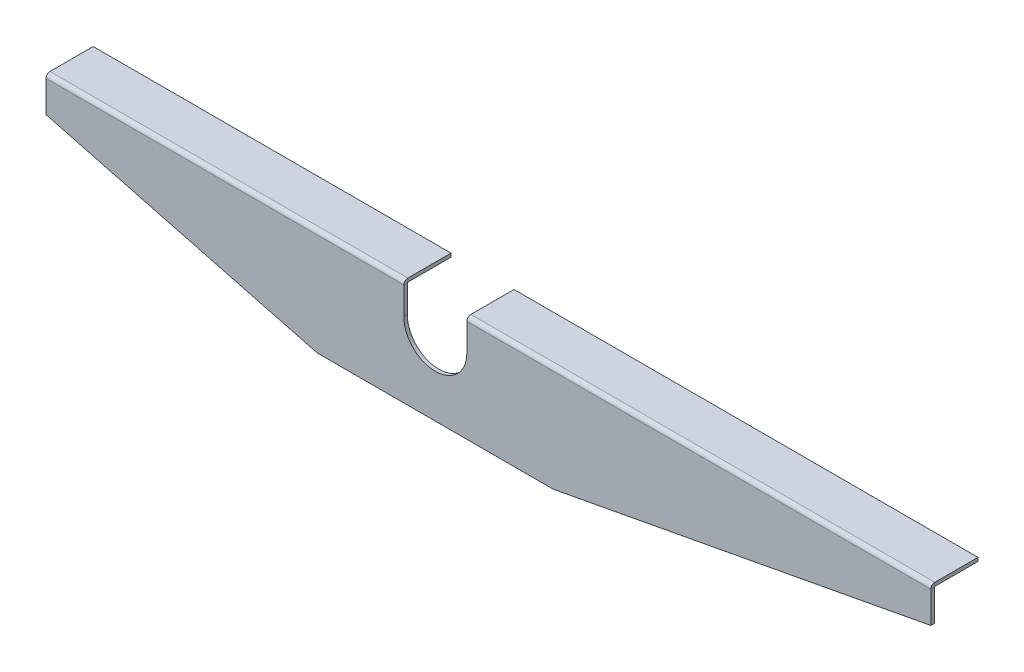
ISO-10303-21;
HEADER;
FILE_DESCRIPTION(('STEP AP214'),'2;1');
FILE_NAME('part.step','',(''),(''),'','','');
FILE_SCHEMA(('AUTOMOTIVE_DESIGN { 1 0 10303 214 1 1 1 1 }'));
ENDSEC;
DATA;
#1=APPLICATION_CONTEXT('core data for automotive mechanical design processes');
#2=APPLICATION_PROTOCOL_DEFINITION('international standard','automotive_design',2000,#1);
#3=PRODUCT_CONTEXT('',#1,'mechanical');
#4=PRODUCT('Part','Part','',(#3));
#5=PRODUCT_RELATED_PRODUCT_CATEGORY('part','',(#4));
#6=PRODUCT_DEFINITION_FORMATION('','',#4);
#7=PRODUCT_DEFINITION_CONTEXT('part definition',#1,'design');
#8=PRODUCT_DEFINITION('design','',#6,#7);
#9=PRODUCT_DEFINITION_SHAPE('','',#8);
#10=(LENGTH_UNIT() NAMED_UNIT(*) SI_UNIT(.MILLI.,.METRE.));
#11=(NAMED_UNIT(*) PLANE_ANGLE_UNIT() SI_UNIT($,.RADIAN.));
#12=(NAMED_UNIT(*) SI_UNIT($,.STERADIAN.) SOLID_ANGLE_UNIT());
#13=UNCERTAINTY_MEASURE_WITH_UNIT(LENGTH_MEASURE(1.E-05),#10,'distance_accuracy_value','');
#14=(GEOMETRIC_REPRESENTATION_CONTEXT(3) GLOBAL_UNCERTAINTY_ASSIGNED_CONTEXT((#13)) GLOBAL_UNIT_ASSIGNED_CONTEXT((#10,
#11,#12)) REPRESENTATION_CONTEXT('',''));
#15=CARTESIAN_POINT('',(0.,0.,0.));
#16=DIRECTION('',(0.,0.,1.));
#17=DIRECTION('',(1.,0.,0.));
#18=AXIS2_PLACEMENT_3D('',#15,#16,#17);
#19=CARTESIAN_POINT('',(0.,0.,-1.50000000000006));
#20=DIRECTION('',(0.,0.,1.));
#21=DIRECTION('',(1.,0.,0.));
#22=AXIS2_PLACEMENT_3D('',#19,#20,#21);
#23=PLANE('',#22);
#24=DIRECTION('',(1.,0.,0.));
#25=VECTOR('',#24,1.);
#26=CARTESIAN_POINT('',(210.,11.65,-1.50000000000006));
#27=LINE('',#26,#25);
#28=CARTESIAN_POINT('',(210.,11.65,-1.50000000000006));
#29=VERTEX_POINT('',#28);
#30=CARTESIAN_POINT('',(13.35,11.65,-1.50000000000006));
#31=VERTEX_POINT('',#30);
#32=EDGE_CURVE('E686',#29,#31,#27,.F.);
#33=ORIENTED_EDGE('',*,*,#32,.F.);
#34=DIRECTION('',(0.,1.,0.));
#35=VECTOR('',#34,1.);
#36=CARTESIAN_POINT('',(210.,13.35,-1.50000000000006));
#37=LINE('',#36,#35);
#38=CARTESIAN_POINT('',(210.,-1.64999999999998,-1.50000000000006));
#39=VERTEX_POINT('',#38);
#40=EDGE_CURVE('E179',#39,#29,#37,.T.);
#41=ORIENTED_EDGE('',*,*,#40,.F.);
#42=DIRECTION('',(0.982872186934322,0.184288535050185,0.));
#43=VECTOR('',#42,1.);
#44=CARTESIAN_POINT('',(210.,-1.64999999999998,-1.50000000000006));
#45=LINE('',#44,#43);
#46=CARTESIAN_POINT('',(50.,-31.65,-1.50000000000006));
#47=VERTEX_POINT('',#46);
#48=EDGE_CURVE('E161',#47,#39,#45,.T.);
#49=ORIENTED_EDGE('',*,*,#48,.F.);
#50=DIRECTION('',(1.,0.,0.));
#51=VECTOR('',#50,1.);
#52=CARTESIAN_POINT('',(50.,-31.65,-1.50000000000006));
#53=LINE('',#52,#51);
#54=CARTESIAN_POINT('',(-50.,-31.65,-1.50000000000006));
#55=VERTEX_POINT('',#54);
#56=EDGE_CURVE('E176',#55,#47,#53,.T.);
#57=ORIENTED_EDGE('',*,*,#56,.F.);
#58=DIRECTION('',(0.967617272396844,-0.252421897147003,0.));
#59=VECTOR('',#58,1.);
#60=CARTESIAN_POINT('',(-50.,-31.65,-1.50000000000006));
#61=LINE('',#60,#59);
#62=CARTESIAN_POINT('',(-165.,-1.64999999999998,-1.50000000000006));
#63=VERTEX_POINT('',#62);
#64=EDGE_CURVE('E184',#63,#55,#61,.T.);
#65=ORIENTED_EDGE('',*,*,#64,.F.);
#66=DIRECTION('',(0.,-1.,0.));
#67=VECTOR('',#66,1.);
#68=CARTESIAN_POINT('',(-165.,-1.64999999999998,-1.50000000000006));
#69=LINE('',#68,#67);
#70=CARTESIAN_POINT('',(-165.,11.65,-1.50000000000006));
#71=VERTEX_POINT('',#70);
#72=EDGE_CURVE('E188',#71,#63,#69,.T.);
#73=ORIENTED_EDGE('',*,*,#72,.F.);
#74=DIRECTION('',(1.,0.,0.));
#75=VECTOR('',#74,1.);
#76=CARTESIAN_POINT('',(-13.35,11.65,-1.50000000000006));
#77=LINE('',#76,#75);
#78=CARTESIAN_POINT('',(-13.35,11.65,-1.50000000000006));
#79=VERTEX_POINT('',#78);
#80=EDGE_CURVE('E763',#79,#71,#77,.F.);
#81=ORIENTED_EDGE('',*,*,#80,.F.);
#82=DIRECTION('',(0.,1.,0.));
#83=VECTOR('',#82,1.);
#84=CARTESIAN_POINT('',(-13.35,13.35,-1.50000000000006));
#85=LINE('',#84,#83);
#86=CARTESIAN_POINT('',(-13.35,0.,-1.50000000000006));
#87=VERTEX_POINT('',#86);
#88=EDGE_CURVE('E776',#87,#79,#85,.T.);
#89=ORIENTED_EDGE('',*,*,#88,.F.);
#90=CARTESIAN_POINT('',(0.,0.,-1.50000000000006));
#91=DIRECTION('',(0.,0.,-1.));
#92=DIRECTION('',(1.,0.,0.));
#93=AXIS2_PLACEMENT_3D('',#90,#91,#92);
#94=CIRCLE('',#93,13.35);
#95=CARTESIAN_POINT('',(13.35,0.,-1.50000000000006));
#96=VERTEX_POINT('',#95);
#97=EDGE_CURVE('E221',#96,#87,#94,.T.);
#98=ORIENTED_EDGE('',*,*,#97,.F.);
#99=DIRECTION('',(0.,-1.,0.));
#100=VECTOR('',#99,1.);
#101=CARTESIAN_POINT('',(13.35,0.,-1.50000000000006));
#102=LINE('',#101,#100);
#103=EDGE_CURVE('E110',#31,#96,#102,.T.);
#104=ORIENTED_EDGE('',*,*,#103,.F.);
#105=EDGE_LOOP('',(#33,#41,#49,#57,#65,#73,#81,#89,#98,#104));
#106=FACE_BOUND('',#105,.T.);
#107=ADVANCED_FACE('F84',(#106),#23,.F.);
#108=CARTESIAN_POINT('',(0.,0.,0.));
#109=DIRECTION('',(0.,0.,1.));
#110=DIRECTION('',(1.,0.,0.));
#111=AXIS2_PLACEMENT_3D('',#108,#109,#110);
#112=PLANE('',#111);
#113=DIRECTION('',(0.,1.,0.));
#114=VECTOR('',#113,1.);
#115=CARTESIAN_POINT('',(210.,13.35,0.));
#116=LINE('',#115,#114);
#117=CARTESIAN_POINT('',(210.,-1.64999999999998,0.));
#118=VERTEX_POINT('',#117);
#119=CARTESIAN_POINT('',(210.,11.65,0.));
#120=VERTEX_POINT('',#119);
#121=EDGE_CURVE('E216',#118,#120,#116,.T.);
#122=ORIENTED_EDGE('',*,*,#121,.T.);
#123=DIRECTION('',(1.,0.,0.));
#124=VECTOR('',#123,1.);
#125=CARTESIAN_POINT('',(210.,11.65,0.));
#126=LINE('',#125,#124);
#127=CARTESIAN_POINT('',(13.35,11.65,0.));
#128=VERTEX_POINT('',#127);
#129=EDGE_CURVE('E670',#120,#128,#126,.F.);
#130=ORIENTED_EDGE('',*,*,#129,.T.);
#131=DIRECTION('',(0.,-1.,0.));
#132=VECTOR('',#131,1.);
#133=CARTESIAN_POINT('',(13.35,0.,0.));
#134=LINE('',#133,#132);
#135=CARTESIAN_POINT('',(13.35,0.,0.));
#136=VERTEX_POINT('',#135);
#137=EDGE_CURVE('E139',#128,#136,#134,.T.);
#138=ORIENTED_EDGE('',*,*,#137,.T.);
#139=CARTESIAN_POINT('',(0.,0.,0.));
#140=DIRECTION('',(0.,0.,-1.));
#141=DIRECTION('',(1.,0.,0.));
#142=AXIS2_PLACEMENT_3D('',#139,#140,#141);
#143=CIRCLE('',#142,13.35);
#144=CARTESIAN_POINT('',(-13.35,0.,0.));
#145=VERTEX_POINT('',#144);
#146=EDGE_CURVE('E196',#136,#145,#143,.T.);
#147=ORIENTED_EDGE('',*,*,#146,.T.);
#148=DIRECTION('',(0.,1.,0.));
#149=VECTOR('',#148,1.);
#150=CARTESIAN_POINT('',(-13.35,13.35,0.));
#151=LINE('',#150,#149);
#152=CARTESIAN_POINT('',(-13.35,11.65,0.));
#153=VERTEX_POINT('',#152);
#154=EDGE_CURVE('E199',#145,#153,#151,.T.);
#155=ORIENTED_EDGE('',*,*,#154,.T.);
#156=DIRECTION('',(1.,0.,0.));
#157=VECTOR('',#156,1.);
#158=CARTESIAN_POINT('',(-13.35,11.65,0.));
#159=LINE('',#158,#157);
#160=CARTESIAN_POINT('',(-165.,11.65,0.));
#161=VERTEX_POINT('',#160);
#162=EDGE_CURVE('E750',#153,#161,#159,.F.);
#163=ORIENTED_EDGE('',*,*,#162,.T.);
#164=DIRECTION('',(0.,-1.,0.));
#165=VECTOR('',#164,1.);
#166=CARTESIAN_POINT('',(-165.,-1.64999999999998,0.));
#167=LINE('',#166,#165);
#168=CARTESIAN_POINT('',(-165.,-1.64999999999998,0.));
#169=VERTEX_POINT('',#168);
#170=EDGE_CURVE('E204',#161,#169,#167,.T.);
#171=ORIENTED_EDGE('',*,*,#170,.T.);
#172=DIRECTION('',(0.967617272396844,-0.252421897147003,0.));
#173=VECTOR('',#172,1.);
#174=CARTESIAN_POINT('',(-50.,-31.65,0.));
#175=LINE('',#174,#173);
#176=CARTESIAN_POINT('',(-50.,-31.65,0.));
#177=VERTEX_POINT('',#176);
#178=EDGE_CURVE('E207',#169,#177,#175,.T.);
#179=ORIENTED_EDGE('',*,*,#178,.T.);
#180=DIRECTION('',(1.,0.,0.));
#181=VECTOR('',#180,1.);
#182=CARTESIAN_POINT('',(50.,-31.65,0.));
#183=LINE('',#182,#181);
#184=CARTESIAN_POINT('',(50.,-31.65,0.));
#185=VERTEX_POINT('',#184);
#186=EDGE_CURVE('E211',#177,#185,#183,.T.);
#187=ORIENTED_EDGE('',*,*,#186,.T.);
#188=DIRECTION('',(0.982872186934322,0.184288535050185,0.));
#189=VECTOR('',#188,1.);
#190=CARTESIAN_POINT('',(210.,-1.64999999999998,0.));
#191=LINE('',#190,#189);
#192=EDGE_CURVE('E163',#185,#118,#191,.T.);
#193=ORIENTED_EDGE('',*,*,#192,.T.);
#194=EDGE_LOOP('',(#122,#130,#138,#147,#155,#163,#171,#179,#187,#193));
#195=FACE_BOUND('',#194,.T.);
#196=ADVANCED_FACE('F246',(#195),#112,.T.);
#197=CARTESIAN_POINT('',(210.,13.35,-1.50000000000006));
#198=DIRECTION('',(1.,0.,0.));
#199=DIRECTION('',(0.,0.,-1.));
#200=AXIS2_PLACEMENT_3D('',#197,#198,#199);
#201=PLANE('',#200);
#202=ORIENTED_EDGE('',*,*,#40,.T.);
#203=DIRECTION('',(0.,0.,1.));
#204=VECTOR('',#203,1.);
#205=CARTESIAN_POINT('',(210.,11.65,-1.50000000000006));
#206=LINE('',#205,#204);
#207=EDGE_CURVE('E678',#29,#120,#206,.T.);
#208=ORIENTED_EDGE('',*,*,#207,.T.);
#209=ORIENTED_EDGE('',*,*,#121,.F.);
#210=DIRECTION('',(0.,0.,1.));
#211=VECTOR('',#210,1.);
#212=CARTESIAN_POINT('',(210.,-1.64999999999998,-1.50000000000006));
#213=LINE('',#212,#211);
#214=EDGE_CURVE('E94',#39,#118,#213,.T.);
#215=ORIENTED_EDGE('',*,*,#214,.F.);
#216=EDGE_LOOP('',(#202,#208,#209,#215));
#217=FACE_BOUND('',#216,.T.);
#218=ADVANCED_FACE('F250',(#217),#201,.T.);
#219=CARTESIAN_POINT('',(-13.35,13.35,-1.50000000000006));
#220=DIRECTION('',(1.,0.,0.));
#221=DIRECTION('',(0.,0.,-1.));
#222=AXIS2_PLACEMENT_3D('',#219,#220,#221);
#223=PLANE('',#222);
#224=ORIENTED_EDGE('',*,*,#88,.T.);
#225=DIRECTION('',(0.,0.,1.));
#226=VECTOR('',#225,1.);
#227=CARTESIAN_POINT('',(-13.35,11.65,-1.50000000000006));
#228=LINE('',#227,#226);
#229=EDGE_CURVE('E244',#79,#153,#228,.T.);
#230=ORIENTED_EDGE('',*,*,#229,.T.);
#231=ORIENTED_EDGE('',*,*,#154,.F.);
#232=DIRECTION('',(0.,0.,1.));
#233=VECTOR('',#232,1.);
#234=CARTESIAN_POINT('',(-13.35,0.,-1.50000000000006));
#235=LINE('',#234,#233);
#236=EDGE_CURVE('E88',#87,#145,#235,.T.);
#237=ORIENTED_EDGE('',*,*,#236,.F.);
#238=EDGE_LOOP('',(#224,#230,#231,#237));
#239=FACE_BOUND('',#238,.T.);
#240=ADVANCED_FACE('F241',(#239),#223,.T.);
#241=CARTESIAN_POINT('',(0.,0.,-1.50000000000006));
#242=DIRECTION('',(0.,0.,1.));
#243=DIRECTION('',(1.,0.,0.));
#244=AXIS2_PLACEMENT_3D('',#241,#242,#243);
#245=CYLINDRICAL_SURFACE('',#244,13.35);
#246=ORIENTED_EDGE('',*,*,#146,.F.);
#247=DIRECTION('',(0.,0.,1.));
#248=VECTOR('',#247,1.);
#249=CARTESIAN_POINT('',(13.35,0.,-1.50000000000006));
#250=LINE('',#249,#248);
#251=EDGE_CURVE('E13',#96,#136,#250,.T.);
#252=ORIENTED_EDGE('',*,*,#251,.F.);
#253=ORIENTED_EDGE('',*,*,#97,.T.);
#254=ORIENTED_EDGE('',*,*,#236,.T.);
#255=EDGE_LOOP('',(#246,#252,#253,#254));
#256=FACE_BOUND('',#255,.T.);
#257=ADVANCED_FACE('F86',(#256),#245,.F.);
#258=CARTESIAN_POINT('',(13.35,0.,-1.50000000000006));
#259=DIRECTION('',(-1.,0.,0.));
#260=DIRECTION('',(0.,0.,1.));
#261=AXIS2_PLACEMENT_3D('',#258,#259,#260);
#262=PLANE('',#261);
#263=DIRECTION('',(0.,0.,1.));
#264=VECTOR('',#263,1.);
#265=CARTESIAN_POINT('',(13.35,11.65,-1.50000000000006));
#266=LINE('',#265,#264);
#267=EDGE_CURVE('E694',#31,#128,#266,.T.);
#268=ORIENTED_EDGE('',*,*,#267,.F.);
#269=ORIENTED_EDGE('',*,*,#103,.T.);
#270=ORIENTED_EDGE('',*,*,#251,.T.);
#271=ORIENTED_EDGE('',*,*,#137,.F.);
#272=EDGE_LOOP('',(#268,#269,#270,#271));
#273=FACE_BOUND('',#272,.T.);
#274=ADVANCED_FACE('F261',(#273),#262,.T.);
#275=CARTESIAN_POINT('',(210.,-1.64999999999998,-1.50000000000006));
#276=DIRECTION('',(0.184288535050185,-0.982872186934322,0.));
#277=DIRECTION('',(0.982872186934322,0.184288535050185,0.));
#278=AXIS2_PLACEMENT_3D('',#275,#276,#277);
#279=PLANE('',#278);
#280=ORIENTED_EDGE('',*,*,#192,.F.);
#281=DIRECTION('',(0.,0.,1.));
#282=VECTOR('',#281,1.);
#283=CARTESIAN_POINT('',(50.,-31.65,-1.50000000000006));
#284=LINE('',#283,#282);
#285=EDGE_CURVE('E158',#47,#185,#284,.T.);
#286=ORIENTED_EDGE('',*,*,#285,.F.);
#287=ORIENTED_EDGE('',*,*,#48,.T.);
#288=ORIENTED_EDGE('',*,*,#214,.T.);
#289=EDGE_LOOP('',(#280,#286,#287,#288));
#290=FACE_BOUND('',#289,.T.);
#291=ADVANCED_FACE('F160',(#290),#279,.T.);
#292=CARTESIAN_POINT('',(50.,-31.65,-1.50000000000006));
#293=DIRECTION('',(0.,-1.,0.));
#294=DIRECTION('',(1.,0.,0.));
#295=AXIS2_PLACEMENT_3D('',#292,#293,#294);
#296=PLANE('',#295);
#297=ORIENTED_EDGE('',*,*,#186,.F.);
#298=DIRECTION('',(0.,0.,1.));
#299=VECTOR('',#298,1.);
#300=CARTESIAN_POINT('',(-50.,-31.65,-1.50000000000006));
#301=LINE('',#300,#299);
#302=EDGE_CURVE('E169',#55,#177,#301,.T.);
#303=ORIENTED_EDGE('',*,*,#302,.F.);
#304=ORIENTED_EDGE('',*,*,#56,.T.);
#305=ORIENTED_EDGE('',*,*,#285,.T.);
#306=EDGE_LOOP('',(#297,#303,#304,#305));
#307=FACE_BOUND('',#306,.T.);
#308=ADVANCED_FACE('F182',(#307),#296,.T.);
#309=CARTESIAN_POINT('',(-50.,-31.65,-1.50000000000006));
#310=DIRECTION('',(-0.252421897147003,-0.967617272396844,0.));
#311=DIRECTION('',(0.967617272396844,-0.252421897147003,0.));
#312=AXIS2_PLACEMENT_3D('',#309,#310,#311);
#313=PLANE('',#312);
#314=ORIENTED_EDGE('',*,*,#178,.F.);
#315=DIRECTION('',(0.,0.,1.));
#316=VECTOR('',#315,1.);
#317=CARTESIAN_POINT('',(-165.,-1.64999999999998,-1.50000000000006));
#318=LINE('',#317,#316);
#319=EDGE_CURVE('E226',#63,#169,#318,.T.);
#320=ORIENTED_EDGE('',*,*,#319,.F.);
#321=ORIENTED_EDGE('',*,*,#64,.T.);
#322=ORIENTED_EDGE('',*,*,#302,.T.);
#323=EDGE_LOOP('',(#314,#320,#321,#322));
#324=FACE_BOUND('',#323,.T.);
#325=ADVANCED_FACE('F268',(#324),#313,.T.);
#326=CARTESIAN_POINT('',(-165.,-1.64999999999998,-1.50000000000006));
#327=DIRECTION('',(-1.,0.,0.));
#328=DIRECTION('',(0.,0.,1.));
#329=AXIS2_PLACEMENT_3D('',#326,#327,#328);
#330=PLANE('',#329);
#331=DIRECTION('',(0.,0.,1.));
#332=VECTOR('',#331,1.);
#333=CARTESIAN_POINT('',(-165.,11.65,-1.50000000000006));
#334=LINE('',#333,#332);
#335=EDGE_CURVE('E200',#71,#161,#334,.T.);
#336=ORIENTED_EDGE('',*,*,#335,.F.);
#337=ORIENTED_EDGE('',*,*,#72,.T.);
#338=ORIENTED_EDGE('',*,*,#319,.T.);
#339=ORIENTED_EDGE('',*,*,#170,.F.);
#340=EDGE_LOOP('',(#336,#337,#338,#339));
#341=FACE_BOUND('',#340,.T.);
#342=ADVANCED_FACE('F271',(#341),#330,.T.);
#343=CARTESIAN_POINT('',(-165.,11.65,-1.70000000000003));
#344=DIRECTION('',(-1.,0.,0.));
#345=DIRECTION('',(0.,0.,1.));
#346=AXIS2_PLACEMENT_3D('',#343,#344,#345);
#347=PLANE('',#346);
#348=DIRECTION('',(0.,1.,0.));
#349=VECTOR('',#348,1.);
#350=CARTESIAN_POINT('',(-165.,13.35,-1.70000000000003));
#351=LINE('',#350,#349);
#352=CARTESIAN_POINT('',(-165.,11.85,-1.70000000000003));
#353=VERTEX_POINT('',#352);
#354=CARTESIAN_POINT('',(-165.,13.35,-1.70000000000003));
#355=VERTEX_POINT('',#354);
#356=EDGE_CURVE('E698',#353,#355,#351,.T.);
#357=ORIENTED_EDGE('',*,*,#356,.F.);
#358=CARTESIAN_POINT('',(-165.,11.65,-1.70000000000003));
#359=DIRECTION('',(1.,0.,0.));
#360=DIRECTION('',(0.,0.,-1.));
#361=AXIS2_PLACEMENT_3D('',#358,#359,#360);
#362=CIRCLE('',#361,0.200000000000002);
#363=EDGE_CURVE('E759',#71,#353,#362,.F.);
#364=ORIENTED_EDGE('',*,*,#363,.F.);
#365=ORIENTED_EDGE('',*,*,#335,.T.);
#366=CARTESIAN_POINT('',(-165.,11.65,-1.70000000000003));
#367=DIRECTION('',(1.,0.,0.));
#368=DIRECTION('',(0.,0.,-1.));
#369=AXIS2_PLACEMENT_3D('',#366,#367,#368);
#370=CIRCLE('',#369,1.7);
#371=EDGE_CURVE('E102',#161,#355,#370,.F.);
#372=ORIENTED_EDGE('',*,*,#371,.T.);
#373=EDGE_LOOP('',(#357,#364,#365,#372));
#374=FACE_BOUND('',#373,.T.);
#375=ADVANCED_FACE('F274',(#374),#347,.T.);
#376=CARTESIAN_POINT('',(-13.35,11.65,-1.70000000000003));
#377=DIRECTION('',(-1.,0.,0.));
#378=DIRECTION('',(0.,0.,1.));
#379=AXIS2_PLACEMENT_3D('',#376,#377,#378);
#380=PLANE('',#379);
#381=CARTESIAN_POINT('',(-13.35,11.65,-1.70000000000003));
#382=DIRECTION('',(1.,0.,0.));
#383=DIRECTION('',(0.,0.,-1.));
#384=AXIS2_PLACEMENT_3D('',#381,#382,#383);
#385=CIRCLE('',#384,0.200000000000002);
#386=CARTESIAN_POINT('',(-13.35,11.85,-1.70000000000003));
#387=VERTEX_POINT('',#386);
#388=EDGE_CURVE('E706',#387,#79,#385,.T.);
#389=ORIENTED_EDGE('',*,*,#388,.F.);
#390=DIRECTION('',(0.,1.,0.));
#391=VECTOR('',#390,1.);
#392=CARTESIAN_POINT('',(-13.35,11.85,-1.70000000000003));
#393=LINE('',#392,#391);
#394=CARTESIAN_POINT('',(-13.35,13.35,-1.70000000000003));
#395=VERTEX_POINT('',#394);
#396=EDGE_CURVE('E739',#387,#395,#393,.T.);
#397=ORIENTED_EDGE('',*,*,#396,.T.);
#398=CARTESIAN_POINT('',(-13.35,11.65,-1.70000000000003));
#399=DIRECTION('',(1.,0.,0.));
#400=DIRECTION('',(0.,0.,-1.));
#401=AXIS2_PLACEMENT_3D('',#398,#399,#400);
#402=CIRCLE('',#401,1.7);
#403=EDGE_CURVE('E753',#395,#153,#402,.T.);
#404=ORIENTED_EDGE('',*,*,#403,.T.);
#405=ORIENTED_EDGE('',*,*,#229,.F.);
#406=EDGE_LOOP('',(#389,#397,#404,#405));
#407=FACE_BOUND('',#406,.T.);
#408=ADVANCED_FACE('F307',(#407),#380,.F.);
#409=CARTESIAN_POINT('',(-13.35,11.65,-1.70000000000003));
#410=DIRECTION('',(1.,0.,0.));
#411=DIRECTION('',(0.,1.,0.));
#412=AXIS2_PLACEMENT_3D('',#409,#410,#411);
#413=CYLINDRICAL_SURFACE('',#412,1.7);
#414=ORIENTED_EDGE('',*,*,#162,.F.);
#415=ORIENTED_EDGE('',*,*,#403,.F.);
#416=DIRECTION('',(1.,0.,0.));
#417=VECTOR('',#416,1.);
#418=CARTESIAN_POINT('',(0.,13.35,-1.70000000000003));
#419=LINE('',#418,#417);
#420=EDGE_CURVE('E735',#355,#395,#419,.T.);
#421=ORIENTED_EDGE('',*,*,#420,.F.);
#422=ORIENTED_EDGE('',*,*,#371,.F.);
#423=EDGE_LOOP('',(#414,#415,#421,#422));
#424=FACE_BOUND('',#423,.T.);
#425=ADVANCED_FACE('F315',(#424),#413,.T.);
#426=CARTESIAN_POINT('',(-13.35,11.65,-1.70000000000003));
#427=DIRECTION('',(1.,0.,0.));
#428=DIRECTION('',(0.,1.,0.));
#429=AXIS2_PLACEMENT_3D('',#426,#427,#428);
#430=CYLINDRICAL_SURFACE('',#429,0.200000000000002);
#431=ORIENTED_EDGE('',*,*,#80,.T.);
#432=ORIENTED_EDGE('',*,*,#363,.T.);
#433=DIRECTION('',(-1.,0.,0.));
#434=VECTOR('',#433,1.);
#435=CARTESIAN_POINT('',(-165.,11.85,-1.70000000000003));
#436=LINE('',#435,#434);
#437=EDGE_CURVE('E743',#353,#387,#436,.F.);
#438=ORIENTED_EDGE('',*,*,#437,.T.);
#439=ORIENTED_EDGE('',*,*,#388,.T.);
#440=EDGE_LOOP('',(#431,#432,#438,#439));
#441=FACE_BOUND('',#440,.T.);
#442=ADVANCED_FACE('F322',(#441),#430,.F.);
#443=CARTESIAN_POINT('',(-13.35,13.35,-1.50000000000006));
#444=DIRECTION('',(1.,0.,0.));
#445=DIRECTION('',(0.,0.,-1.));
#446=AXIS2_PLACEMENT_3D('',#443,#444,#445);
#447=PLANE('',#446);
#448=DIRECTION('',(0.,0.,1.));
#449=VECTOR('',#448,1.);
#450=CARTESIAN_POINT('',(-13.35,13.35,-1.50000000000006));
#451=LINE('',#450,#449);
#452=CARTESIAN_POINT('',(-13.35,13.3500000000001,-20.));
#453=VERTEX_POINT('',#452);
#454=EDGE_CURVE('E711',#453,#395,#451,.T.);
#455=ORIENTED_EDGE('',*,*,#454,.T.);
#456=ORIENTED_EDGE('',*,*,#396,.F.);
#457=DIRECTION('',(0.,0.,-1.));
#458=VECTOR('',#457,1.);
#459=CARTESIAN_POINT('',(-13.35,11.85,0.));
#460=LINE('',#459,#458);
#461=CARTESIAN_POINT('',(-13.35,11.8500000000001,-20.));
#462=VERTEX_POINT('',#461);
#463=EDGE_CURVE('E723',#462,#387,#460,.F.);
#464=ORIENTED_EDGE('',*,*,#463,.F.);
#465=DIRECTION('',(0.,-1.,0.));
#466=VECTOR('',#465,1.);
#467=CARTESIAN_POINT('',(-13.35,13.3500000000001,-20.));
#468=LINE('',#467,#466);
#469=EDGE_CURVE('E702',#453,#462,#468,.T.);
#470=ORIENTED_EDGE('',*,*,#469,.F.);
#471=EDGE_LOOP('',(#455,#456,#464,#470));
#472=FACE_BOUND('',#471,.T.);
#473=ADVANCED_FACE('F329',(#472),#447,.T.);
#474=CARTESIAN_POINT('',(-165.,13.3500000000001,-20.));
#475=DIRECTION('',(-1.,0.,0.));
#476=DIRECTION('',(0.,-1.,0.));
#477=AXIS2_PLACEMENT_3D('',#474,#475,#476);
#478=PLANE('',#477);
#479=DIRECTION('',(0.,0.,1.));
#480=VECTOR('',#479,1.);
#481=CARTESIAN_POINT('',(-165.,11.85,0.));
#482=LINE('',#481,#480);
#483=CARTESIAN_POINT('',(-165.,11.8500000000001,-20.));
#484=VERTEX_POINT('',#483);
#485=EDGE_CURVE('E731',#353,#484,#482,.F.);
#486=ORIENTED_EDGE('',*,*,#485,.F.);
#487=ORIENTED_EDGE('',*,*,#356,.T.);
#488=DIRECTION('',(0.,0.,-1.));
#489=VECTOR('',#488,1.);
#490=CARTESIAN_POINT('',(-165.,13.3500000000001,-20.));
#491=LINE('',#490,#489);
#492=CARTESIAN_POINT('',(-165.,13.3500000000001,-20.));
#493=VERTEX_POINT('',#492);
#494=EDGE_CURVE('E719',#355,#493,#491,.T.);
#495=ORIENTED_EDGE('',*,*,#494,.T.);
#496=DIRECTION('',(0.,-1.,0.));
#497=VECTOR('',#496,1.);
#498=CARTESIAN_POINT('',(-165.,13.3500000000001,-20.));
#499=LINE('',#498,#497);
#500=EDGE_CURVE('E707',#493,#484,#499,.T.);
#501=ORIENTED_EDGE('',*,*,#500,.T.);
#502=EDGE_LOOP('',(#486,#487,#495,#501));
#503=FACE_BOUND('',#502,.T.);
#504=ADVANCED_FACE('F337',(#503),#478,.T.);
#505=CARTESIAN_POINT('',(0.,13.35,0.));
#506=DIRECTION('',(0.,1.,0.));
#507=DIRECTION('',(0.,0.,1.));
#508=AXIS2_PLACEMENT_3D('',#505,#506,#507);
#509=PLANE('',#508);
#510=ORIENTED_EDGE('',*,*,#494,.F.);
#511=ORIENTED_EDGE('',*,*,#420,.T.);
#512=ORIENTED_EDGE('',*,*,#454,.F.);
#513=DIRECTION('',(1.,0.,0.));
#514=VECTOR('',#513,1.);
#515=CARTESIAN_POINT('',(-13.35,13.3500000000001,-20.));
#516=LINE('',#515,#514);
#517=EDGE_CURVE('E715',#493,#453,#516,.T.);
#518=ORIENTED_EDGE('',*,*,#517,.F.);
#519=EDGE_LOOP('',(#510,#511,#512,#518));
#520=FACE_BOUND('',#519,.T.);
#521=ADVANCED_FACE('F345',(#520),#509,.T.);
#522=CARTESIAN_POINT('',(0.,11.85,0.));
#523=DIRECTION('',(0.,1.,0.));
#524=DIRECTION('',(0.,0.,1.));
#525=AXIS2_PLACEMENT_3D('',#522,#523,#524);
#526=PLANE('',#525);
#527=ORIENTED_EDGE('',*,*,#437,.F.);
#528=ORIENTED_EDGE('',*,*,#485,.T.);
#529=DIRECTION('',(-1.,0.,0.));
#530=VECTOR('',#529,1.);
#531=CARTESIAN_POINT('',(0.,11.8500000000001,-20.));
#532=LINE('',#531,#530);
#533=EDGE_CURVE('E727',#484,#462,#532,.F.);
#534=ORIENTED_EDGE('',*,*,#533,.T.);
#535=ORIENTED_EDGE('',*,*,#463,.T.);
#536=EDGE_LOOP('',(#527,#528,#534,#535));
#537=FACE_BOUND('',#536,.T.);
#538=ADVANCED_FACE('F353',(#537),#526,.F.);
#539=CARTESIAN_POINT('',(-13.35,13.3500000000001,-20.));
#540=DIRECTION('',(0.,0.,-1.));
#541=DIRECTION('',(0.,1.,0.));
#542=AXIS2_PLACEMENT_3D('',#539,#540,#541);
#543=PLANE('',#542);
#544=ORIENTED_EDGE('',*,*,#533,.F.);
#545=ORIENTED_EDGE('',*,*,#500,.F.);
#546=ORIENTED_EDGE('',*,*,#517,.T.);
#547=ORIENTED_EDGE('',*,*,#469,.T.);
#548=EDGE_LOOP('',(#544,#545,#546,#547));
#549=FACE_BOUND('',#548,.T.);
#550=ADVANCED_FACE('F361',(#549),#543,.T.);
#551=CARTESIAN_POINT('',(13.35,11.65,-1.70000000000003));
#552=DIRECTION('',(-1.,0.,0.));
#553=DIRECTION('',(0.,0.,1.));
#554=AXIS2_PLACEMENT_3D('',#551,#552,#553);
#555=PLANE('',#554);
#556=DIRECTION('',(0.,1.,0.));
#557=VECTOR('',#556,1.);
#558=CARTESIAN_POINT('',(13.35,13.35,-1.70000000000003));
#559=LINE('',#558,#557);
#560=CARTESIAN_POINT('',(13.35,11.85,-1.70000000000003));
#561=VERTEX_POINT('',#560);
#562=CARTESIAN_POINT('',(13.35,13.35,-1.70000000000003));
#563=VERTEX_POINT('',#562);
#564=EDGE_CURVE('E666',#561,#563,#559,.T.);
#565=ORIENTED_EDGE('',*,*,#564,.F.);
#566=CARTESIAN_POINT('',(13.35,11.65,-1.70000000000003));
#567=DIRECTION('',(1.,0.,0.));
#568=DIRECTION('',(0.,0.,-1.));
#569=AXIS2_PLACEMENT_3D('',#566,#567,#568);
#570=CIRCLE('',#569,0.200000000000001);
#571=EDGE_CURVE('E682',#31,#561,#570,.F.);
#572=ORIENTED_EDGE('',*,*,#571,.F.);
#573=ORIENTED_EDGE('',*,*,#267,.T.);
#574=CARTESIAN_POINT('',(13.35,11.65,-1.70000000000003));
#575=DIRECTION('',(1.,0.,0.));
#576=DIRECTION('',(0.,0.,-1.));
#577=AXIS2_PLACEMENT_3D('',#574,#575,#576);
#578=CIRCLE('',#577,1.7);
#579=EDGE_CURVE('E673',#128,#563,#578,.F.);
#580=ORIENTED_EDGE('',*,*,#579,.T.);
#581=EDGE_LOOP('',(#565,#572,#573,#580));
#582=FACE_BOUND('',#581,.T.);
#583=ADVANCED_FACE('F369',(#582),#555,.T.);
#584=CARTESIAN_POINT('',(210.,11.65,-1.70000000000003));
#585=DIRECTION('',(-1.,0.,0.));
#586=DIRECTION('',(0.,0.,1.));
#587=AXIS2_PLACEMENT_3D('',#584,#585,#586);
#588=PLANE('',#587);
#589=CARTESIAN_POINT('',(210.,11.65,-1.70000000000003));
#590=DIRECTION('',(1.,0.,0.));
#591=DIRECTION('',(0.,0.,-1.));
#592=AXIS2_PLACEMENT_3D('',#589,#590,#591);
#593=CIRCLE('',#592,0.200000000000001);
#594=CARTESIAN_POINT('',(210.,11.85,-1.70000000000003));
#595=VERTEX_POINT('',#594);
#596=EDGE_CURVE('E690',#595,#29,#593,.T.);
#597=ORIENTED_EDGE('',*,*,#596,.F.);
#598=DIRECTION('',(0.,1.,0.));
#599=VECTOR('',#598,1.);
#600=CARTESIAN_POINT('',(210.,11.85,-1.70000000000003));
#601=LINE('',#600,#599);
#602=CARTESIAN_POINT('',(210.,13.35,-1.70000000000003));
#603=VERTEX_POINT('',#602);
#604=EDGE_CURVE('E658',#595,#603,#601,.T.);
#605=ORIENTED_EDGE('',*,*,#604,.T.);
#606=CARTESIAN_POINT('',(210.,11.65,-1.70000000000003));
#607=DIRECTION('',(1.,0.,0.));
#608=DIRECTION('',(0.,0.,-1.));
#609=AXIS2_PLACEMENT_3D('',#606,#607,#608);
#610=CIRCLE('',#609,1.7);
#611=EDGE_CURVE('E674',#603,#120,#610,.T.);
#612=ORIENTED_EDGE('',*,*,#611,.T.);
#613=ORIENTED_EDGE('',*,*,#207,.F.);
#614=EDGE_LOOP('',(#597,#605,#612,#613));
#615=FACE_BOUND('',#614,.T.);
#616=ADVANCED_FACE('F377',(#615),#588,.F.);
#617=CARTESIAN_POINT('',(210.,11.65,-1.70000000000003));
#618=DIRECTION('',(1.,0.,0.));
#619=DIRECTION('',(0.,1.,0.));
#620=AXIS2_PLACEMENT_3D('',#617,#618,#619);
#621=CYLINDRICAL_SURFACE('',#620,1.7);
#622=ORIENTED_EDGE('',*,*,#129,.F.);
#623=ORIENTED_EDGE('',*,*,#611,.F.);
#624=DIRECTION('',(1.,0.,0.));
#625=VECTOR('',#624,1.);
#626=CARTESIAN_POINT('',(0.,13.35,-1.70000000000003));
#627=LINE('',#626,#625);
#628=EDGE_CURVE('E651',#563,#603,#627,.T.);
#629=ORIENTED_EDGE('',*,*,#628,.F.);
#630=ORIENTED_EDGE('',*,*,#579,.F.);
#631=EDGE_LOOP('',(#622,#623,#629,#630));
#632=FACE_BOUND('',#631,.T.);
#633=ADVANCED_FACE('F385',(#632),#621,.T.);
#634=CARTESIAN_POINT('',(210.,11.65,-1.70000000000003));
#635=DIRECTION('',(1.,0.,0.));
#636=DIRECTION('',(0.,1.,0.));
#637=AXIS2_PLACEMENT_3D('',#634,#635,#636);
#638=CYLINDRICAL_SURFACE('',#637,0.200000000000001);
#639=ORIENTED_EDGE('',*,*,#32,.T.);
#640=ORIENTED_EDGE('',*,*,#571,.T.);
#641=DIRECTION('',(-1.,0.,0.));
#642=VECTOR('',#641,1.);
#643=CARTESIAN_POINT('',(13.3499999999999,11.85,-1.70000000000003));
#644=LINE('',#643,#642);
#645=EDGE_CURVE('E662',#561,#595,#644,.F.);
#646=ORIENTED_EDGE('',*,*,#645,.T.);
#647=ORIENTED_EDGE('',*,*,#596,.T.);
#648=EDGE_LOOP('',(#639,#640,#646,#647));
#649=FACE_BOUND('',#648,.T.);
#650=ADVANCED_FACE('F393',(#649),#638,.F.);
#651=CARTESIAN_POINT('',(210.,13.35,-1.50000000000006));
#652=DIRECTION('',(1.,0.,0.));
#653=DIRECTION('',(0.,1.,0.));
#654=AXIS2_PLACEMENT_3D('',#651,#652,#653);
#655=PLANE('',#654);
#656=DIRECTION('',(0.,0.,1.));
#657=VECTOR('',#656,1.);
#658=CARTESIAN_POINT('',(210.,13.35,-1.50000000000006));
#659=LINE('',#658,#657);
#660=CARTESIAN_POINT('',(210.,13.3500000000001,-20.));
#661=VERTEX_POINT('',#660);
#662=EDGE_CURVE('E839',#661,#603,#659,.T.);
#663=ORIENTED_EDGE('',*,*,#662,.T.);
#664=ORIENTED_EDGE('',*,*,#604,.F.);
#665=DIRECTION('',(0.,0.,-1.));
#666=VECTOR('',#665,1.);
#667=CARTESIAN_POINT('',(210.,11.85,0.));
#668=LINE('',#667,#666);
#669=CARTESIAN_POINT('',(210.,11.8500000000001,-20.));
#670=VERTEX_POINT('',#669);
#671=EDGE_CURVE('E643',#670,#595,#668,.F.);
#672=ORIENTED_EDGE('',*,*,#671,.F.);
#673=DIRECTION('',(0.,-1.,0.));
#674=VECTOR('',#673,1.);
#675=CARTESIAN_POINT('',(210.,13.3500000000001,-20.));
#676=LINE('',#675,#674);
#677=EDGE_CURVE('E637',#661,#670,#676,.T.);
#678=ORIENTED_EDGE('',*,*,#677,.F.);
#679=EDGE_LOOP('',(#663,#664,#672,#678));
#680=FACE_BOUND('',#679,.T.);
#681=ADVANCED_FACE('F401',(#680),#655,.T.);
#682=CARTESIAN_POINT('',(13.3499999999999,13.3500000000001,-20.));
#683=DIRECTION('',(-1.,0.,0.));
#684=DIRECTION('',(0.,0.,1.));
#685=AXIS2_PLACEMENT_3D('',#682,#683,#684);
#686=PLANE('',#685);
#687=DIRECTION('',(0.,0.,1.));
#688=VECTOR('',#687,1.);
#689=CARTESIAN_POINT('',(13.35,11.85,0.));
#690=LINE('',#689,#688);
#691=CARTESIAN_POINT('',(13.3499999999999,11.8500000000001,-20.));
#692=VERTEX_POINT('',#691);
#693=EDGE_CURVE('E644',#561,#692,#690,.F.);
#694=ORIENTED_EDGE('',*,*,#693,.F.);
#695=ORIENTED_EDGE('',*,*,#564,.T.);
#696=DIRECTION('',(0.,0.,-1.));
#697=VECTOR('',#696,1.);
#698=CARTESIAN_POINT('',(13.3499999999999,13.3500000000001,-20.));
#699=LINE('',#698,#697);
#700=CARTESIAN_POINT('',(13.3499999999999,13.3500000000001,-20.));
#701=VERTEX_POINT('',#700);
#702=EDGE_CURVE('E649',#563,#701,#699,.T.);
#703=ORIENTED_EDGE('',*,*,#702,.T.);
#704=DIRECTION('',(0.,-1.,0.));
#705=VECTOR('',#704,1.);
#706=CARTESIAN_POINT('',(13.3499999999999,13.3500000000001,-20.));
#707=LINE('',#706,#705);
#708=EDGE_CURVE('E633',#701,#692,#707,.T.);
#709=ORIENTED_EDGE('',*,*,#708,.T.);
#710=EDGE_LOOP('',(#694,#695,#703,#709));
#711=FACE_BOUND('',#710,.T.);
#712=ADVANCED_FACE('F409',(#711),#686,.T.);
#713=CARTESIAN_POINT('',(0.,13.35,0.));
#714=DIRECTION('',(0.,1.,0.));
#715=DIRECTION('',(0.,0.,1.));
#716=AXIS2_PLACEMENT_3D('',#713,#714,#715);
#717=PLANE('',#716);
#718=ORIENTED_EDGE('',*,*,#702,.F.);
#719=ORIENTED_EDGE('',*,*,#628,.T.);
#720=ORIENTED_EDGE('',*,*,#662,.F.);
#721=DIRECTION('',(1.,0.,0.));
#722=VECTOR('',#721,1.);
#723=CARTESIAN_POINT('',(210.,13.3500000000001,-20.));
#724=LINE('',#723,#722);
#725=EDGE_CURVE('E844',#701,#661,#724,.T.);
#726=ORIENTED_EDGE('',*,*,#725,.F.);
#727=EDGE_LOOP('',(#718,#719,#720,#726));
#728=FACE_BOUND('',#727,.T.);
#729=ADVANCED_FACE('F417',(#728),#717,.T.);
#730=CARTESIAN_POINT('',(0.,11.85,0.));
#731=DIRECTION('',(0.,1.,0.));
#732=DIRECTION('',(0.,0.,1.));
#733=AXIS2_PLACEMENT_3D('',#730,#731,#732);
#734=PLANE('',#733);
#735=ORIENTED_EDGE('',*,*,#645,.F.);
#736=ORIENTED_EDGE('',*,*,#693,.T.);
#737=DIRECTION('',(-1.,0.,0.));
#738=VECTOR('',#737,1.);
#739=CARTESIAN_POINT('',(0.,11.8500000000001,-20.));
#740=LINE('',#739,#738);
#741=EDGE_CURVE('E629',#692,#670,#740,.F.);
#742=ORIENTED_EDGE('',*,*,#741,.T.);
#743=ORIENTED_EDGE('',*,*,#671,.T.);
#744=EDGE_LOOP('',(#735,#736,#742,#743));
#745=FACE_BOUND('',#744,.T.);
#746=ADVANCED_FACE('F425',(#745),#734,.F.);
#747=CARTESIAN_POINT('',(210.,13.3500000000001,-20.));
#748=DIRECTION('',(0.,0.,-1.));
#749=DIRECTION('',(0.,1.,0.));
#750=AXIS2_PLACEMENT_3D('',#747,#748,#749);
#751=PLANE('',#750);
#752=ORIENTED_EDGE('',*,*,#741,.F.);
#753=ORIENTED_EDGE('',*,*,#708,.F.);
#754=ORIENTED_EDGE('',*,*,#725,.T.);
#755=ORIENTED_EDGE('',*,*,#677,.T.);
#756=EDGE_LOOP('',(#752,#753,#754,#755));
#757=FACE_BOUND('',#756,.T.);
#758=ADVANCED_FACE('F433',(#757),#751,.T.);
#759=CLOSED_SHELL('',(#107,#196,#218,#240,#257,#274,#291,#308,#325,#342,#375,#408,#425,#442,
#473,#504,#521,#538,#550,#583,#616,#633,#650,#681,#712,#729,#746,#758));
#760=MANIFOLD_SOLID_BREP('B2',#759);
#761=ADVANCED_BREP_SHAPE_REPRESENTATION('',(#18,#760),#14);
#762=SHAPE_DEFINITION_REPRESENTATION(#9,#761);
ENDSEC;
END-ISO-10303-21;
